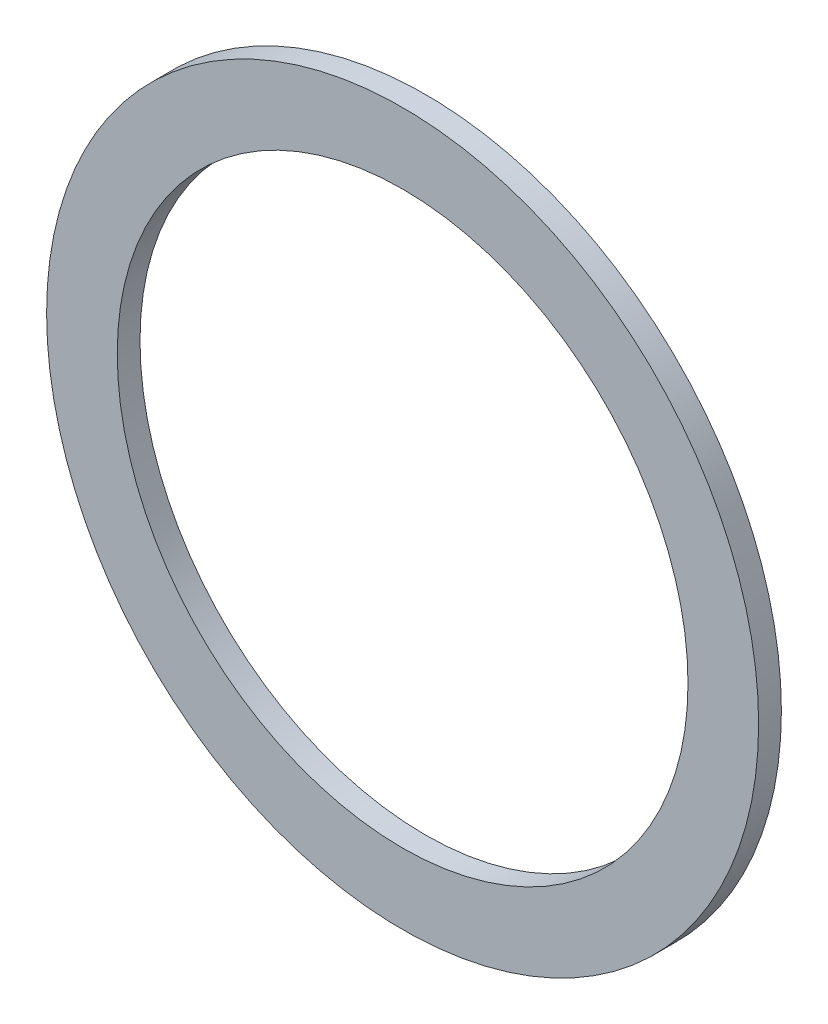
ISO-10303-21;
HEADER;
FILE_DESCRIPTION(('STEP AP214'),'2;1');
FILE_NAME('part.step','',(''),(''),'','','');
FILE_SCHEMA(('AUTOMOTIVE_DESIGN { 1 0 10303 214 1 1 1 1 }'));
ENDSEC;
DATA;
#1=APPLICATION_CONTEXT('core data for automotive mechanical design processes');
#2=APPLICATION_PROTOCOL_DEFINITION('international standard','automotive_design',2000,#1);
#3=PRODUCT_CONTEXT('',#1,'mechanical');
#4=PRODUCT('Part','Part','',(#3));
#5=PRODUCT_RELATED_PRODUCT_CATEGORY('part','',(#4));
#6=PRODUCT_DEFINITION_FORMATION('','',#4);
#7=PRODUCT_DEFINITION_CONTEXT('part definition',#1,'design');
#8=PRODUCT_DEFINITION('design','',#6,#7);
#9=PRODUCT_DEFINITION_SHAPE('','',#8);
#10=(LENGTH_UNIT() NAMED_UNIT(*) SI_UNIT(.MILLI.,.METRE.));
#11=(NAMED_UNIT(*) PLANE_ANGLE_UNIT() SI_UNIT($,.RADIAN.));
#12=(NAMED_UNIT(*) SI_UNIT($,.STERADIAN.) SOLID_ANGLE_UNIT());
#13=UNCERTAINTY_MEASURE_WITH_UNIT(LENGTH_MEASURE(1.E-05),#10,'distance_accuracy_value','');
#14=(GEOMETRIC_REPRESENTATION_CONTEXT(3) GLOBAL_UNCERTAINTY_ASSIGNED_CONTEXT((#13)) GLOBAL_UNIT_ASSIGNED_CONTEXT((#10,
#11,#12)) REPRESENTATION_CONTEXT('',''));
#15=CARTESIAN_POINT('',(0.,0.,0.));
#16=DIRECTION('',(0.,0.,1.));
#17=DIRECTION('',(1.,0.,0.));
#18=AXIS2_PLACEMENT_3D('',#15,#16,#17);
#19=CARTESIAN_POINT('',(0.,0.,3.175));
#20=DIRECTION('',(0.,0.,1.));
#21=DIRECTION('',(1.,0.,0.));
#22=AXIS2_PLACEMENT_3D('',#19,#20,#21);
#23=PLANE('',#22);
#24=CARTESIAN_POINT('',(0.,0.,3.175));
#25=DIRECTION('',(0.,0.,1.));
#26=DIRECTION('',(1.,0.,0.));
#27=AXIS2_PLACEMENT_3D('',#24,#25,#26);
#28=CIRCLE('',#27,49.6697);
#29=CARTESIAN_POINT('',(49.6697,0.,3.175));
#30=VERTEX_POINT('',#29);
#31=EDGE_CURVE('E10',#30,#30,#28,.T.);
#32=ORIENTED_EDGE('',*,*,#31,.T.);
#33=EDGE_LOOP('',(#32));
#34=FACE_BOUND('',#33,.T.);
#35=CARTESIAN_POINT('',(0.,0.,3.175));
#36=DIRECTION('',(0.,0.,1.));
#37=DIRECTION('',(1.,0.,0.));
#38=AXIS2_PLACEMENT_3D('',#35,#36,#37);
#39=CIRCLE('',#38,39.8145);
#40=CARTESIAN_POINT('',(39.8145,0.,3.175));
#41=VERTEX_POINT('',#40);
#42=EDGE_CURVE('E51',#41,#41,#39,.T.);
#43=ORIENTED_EDGE('',*,*,#42,.F.);
#44=EDGE_LOOP('',(#43));
#45=FACE_BOUND('',#44,.T.);
#46=ADVANCED_FACE('F37',(#34,#45),#23,.T.);
#47=CARTESIAN_POINT('',(0.,0.,0.));
#48=DIRECTION('',(0.,0.,1.));
#49=DIRECTION('',(1.,0.,0.));
#50=AXIS2_PLACEMENT_3D('',#47,#48,#49);
#51=PLANE('',#50);
#52=CARTESIAN_POINT('',(0.,0.,0.));
#53=DIRECTION('',(0.,0.,1.));
#54=DIRECTION('',(1.,0.,0.));
#55=AXIS2_PLACEMENT_3D('',#52,#53,#54);
#56=CIRCLE('',#55,49.6697);
#57=CARTESIAN_POINT('',(49.6697,0.,0.));
#58=VERTEX_POINT('',#57);
#59=EDGE_CURVE('E41',#58,#58,#56,.T.);
#60=ORIENTED_EDGE('',*,*,#59,.F.);
#61=EDGE_LOOP('',(#60));
#62=FACE_BOUND('',#61,.T.);
#63=CARTESIAN_POINT('',(0.,0.,0.));
#64=DIRECTION('',(0.,0.,1.));
#65=DIRECTION('',(1.,0.,0.));
#66=AXIS2_PLACEMENT_3D('',#63,#64,#65);
#67=CIRCLE('',#66,39.8145);
#68=CARTESIAN_POINT('',(39.8145,0.,0.));
#69=VERTEX_POINT('',#68);
#70=EDGE_CURVE('E53',#69,#69,#67,.T.);
#71=ORIENTED_EDGE('',*,*,#70,.T.);
#72=EDGE_LOOP('',(#71));
#73=FACE_BOUND('',#72,.T.);
#74=ADVANCED_FACE('F64',(#62,#73),#51,.F.);
#75=CARTESIAN_POINT('',(0.,0.,3.175));
#76=DIRECTION('',(0.,0.,-1.));
#77=DIRECTION('',(-1.,0.,0.));
#78=AXIS2_PLACEMENT_3D('',#75,#76,#77);
#79=CYLINDRICAL_SURFACE('',#78,49.6697);
#80=ORIENTED_EDGE('',*,*,#31,.F.);
#81=EDGE_LOOP('',(#80));
#82=FACE_BOUND('',#81,.T.);
#83=ORIENTED_EDGE('',*,*,#59,.T.);
#84=EDGE_LOOP('',(#83));
#85=FACE_BOUND('',#84,.T.);
#86=ADVANCED_FACE('F39',(#82,#85),#79,.T.);
#87=CARTESIAN_POINT('',(0.,0.,3.175));
#88=DIRECTION('',(0.,0.,-1.));
#89=DIRECTION('',(-1.,0.,0.));
#90=AXIS2_PLACEMENT_3D('',#87,#88,#89);
#91=CYLINDRICAL_SURFACE('',#90,39.8145);
#92=ORIENTED_EDGE('',*,*,#42,.T.);
#93=EDGE_LOOP('',(#92));
#94=FACE_BOUND('',#93,.T.);
#95=ORIENTED_EDGE('',*,*,#70,.F.);
#96=EDGE_LOOP('',(#95));
#97=FACE_BOUND('',#96,.T.);
#98=ADVANCED_FACE('F60',(#94,#97),#91,.F.);
#99=CLOSED_SHELL('',(#46,#74,#86,#98));
#100=MANIFOLD_SOLID_BREP('B2',#99);
#101=ADVANCED_BREP_SHAPE_REPRESENTATION('',(#18,#100),#14);
#102=SHAPE_DEFINITION_REPRESENTATION(#9,#101);
ENDSEC;
END-ISO-10303-21;
